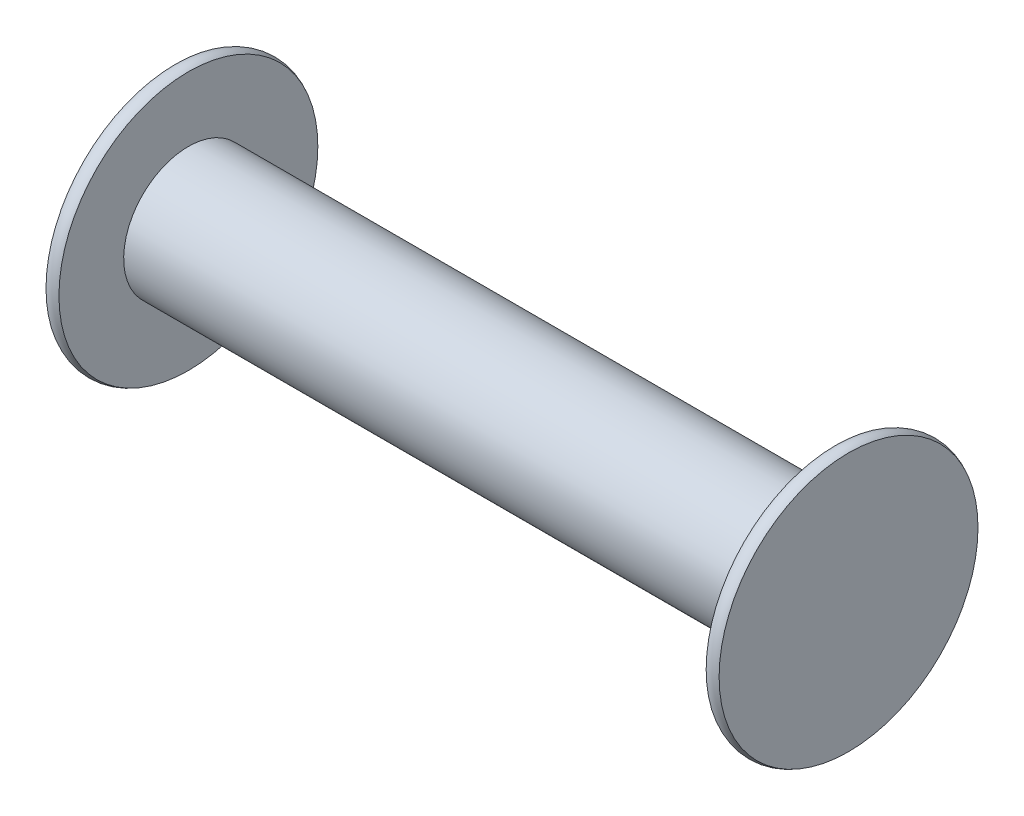
ISO-10303-21;
HEADER;
FILE_DESCRIPTION(('STEP AP214'),'2;1');
FILE_NAME('part.step','',(''),(''),'','','');
FILE_SCHEMA(('AUTOMOTIVE_DESIGN { 1 0 10303 214 1 1 1 1 }'));
ENDSEC;
DATA;
#1=APPLICATION_CONTEXT('core data for automotive mechanical design processes');
#2=APPLICATION_PROTOCOL_DEFINITION('international standard','automotive_design',2000,#1);
#3=PRODUCT_CONTEXT('',#1,'mechanical');
#4=PRODUCT('Part','Part','',(#3));
#5=PRODUCT_RELATED_PRODUCT_CATEGORY('part','',(#4));
#6=PRODUCT_DEFINITION_FORMATION('','',#4);
#7=PRODUCT_DEFINITION_CONTEXT('part definition',#1,'design');
#8=PRODUCT_DEFINITION('design','',#6,#7);
#9=PRODUCT_DEFINITION_SHAPE('','',#8);
#10=(LENGTH_UNIT() NAMED_UNIT(*) SI_UNIT(.MILLI.,.METRE.));
#11=(NAMED_UNIT(*) PLANE_ANGLE_UNIT() SI_UNIT($,.RADIAN.));
#12=(NAMED_UNIT(*) SI_UNIT($,.STERADIAN.) SOLID_ANGLE_UNIT());
#13=UNCERTAINTY_MEASURE_WITH_UNIT(LENGTH_MEASURE(1.E-05),#10,'distance_accuracy_value','');
#14=(GEOMETRIC_REPRESENTATION_CONTEXT(3) GLOBAL_UNCERTAINTY_ASSIGNED_CONTEXT((#13)) GLOBAL_UNIT_ASSIGNED_CONTEXT((#10,
#11,#12)) REPRESENTATION_CONTEXT('',''));
#15=CARTESIAN_POINT('',(0.,0.,0.));
#16=DIRECTION('',(0.,0.,1.));
#17=DIRECTION('',(1.,0.,0.));
#18=AXIS2_PLACEMENT_3D('',#15,#16,#17);
#19=CARTESIAN_POINT('',(-26.,0.,0.));
#20=DIRECTION('',(-1.,0.,0.));
#21=DIRECTION('',(0.,-1.,0.));
#22=AXIS2_PLACEMENT_3D('',#19,#20,#21);
#23=PLANE('',#22);
#24=CARTESIAN_POINT('',(-26.,0.,0.));
#25=DIRECTION('',(-1.,0.,0.));
#26=DIRECTION('',(0.,-1.,0.));
#27=AXIS2_PLACEMENT_3D('',#24,#25,#26);
#28=CIRCLE('',#27,10.);
#29=CARTESIAN_POINT('',(-26.,-10.,0.));
#30=VERTEX_POINT('',#29);
#31=EDGE_CURVE('E10',#30,#30,#28,.T.);
#32=ORIENTED_EDGE('',*,*,#31,.T.);
#33=EDGE_LOOP('',(#32));
#34=FACE_BOUND('',#33,.T.);
#35=ADVANCED_FACE('F37',(#34),#23,.T.);
#36=CARTESIAN_POINT('',(-25.5,0.,0.));
#37=DIRECTION('',(-1.,0.,0.));
#38=DIRECTION('',(0.,-1.,0.));
#39=AXIS2_PLACEMENT_3D('',#36,#37,#38);
#40=TOROIDAL_SURFACE('',#39,9.13397459621556,0.999999999999999);
#41=CARTESIAN_POINT('',(-25.,0.,0.));
#42=DIRECTION('',(-1.,0.,0.));
#43=DIRECTION('',(0.,-1.,0.));
#44=AXIS2_PLACEMENT_3D('',#41,#42,#43);
#45=CIRCLE('',#44,10.);
#46=CARTESIAN_POINT('',(-25.,-10.,0.));
#47=VERTEX_POINT('',#46);
#48=EDGE_CURVE('E44',#47,#47,#45,.T.);
#49=ORIENTED_EDGE('',*,*,#48,.T.);
#50=EDGE_LOOP('',(#49));
#51=FACE_BOUND('',#50,.T.);
#52=ORIENTED_EDGE('',*,*,#31,.F.);
#53=EDGE_LOOP('',(#52));
#54=FACE_BOUND('',#53,.T.);
#55=ADVANCED_FACE('F81',(#51,#54),#40,.T.);
#56=CARTESIAN_POINT('',(-25.,-5.,0.));
#57=DIRECTION('',(1.,0.,0.));
#58=DIRECTION('',(0.,1.,0.));
#59=AXIS2_PLACEMENT_3D('',#56,#57,#58);
#60=PLANE('',#59);
#61=CARTESIAN_POINT('',(-25.,0.,0.));
#62=DIRECTION('',(-1.,0.,0.));
#63=DIRECTION('',(0.,-1.,0.));
#64=AXIS2_PLACEMENT_3D('',#61,#62,#63);
#65=CIRCLE('',#64,5.);
#66=CARTESIAN_POINT('',(-25.,-5.,0.));
#67=VERTEX_POINT('',#66);
#68=EDGE_CURVE('E49',#67,#67,#65,.T.);
#69=ORIENTED_EDGE('',*,*,#68,.T.);
#70=EDGE_LOOP('',(#69));
#71=FACE_BOUND('',#70,.T.);
#72=ORIENTED_EDGE('',*,*,#48,.F.);
#73=EDGE_LOOP('',(#72));
#74=FACE_BOUND('',#73,.T.);
#75=ADVANCED_FACE('F85',(#71,#74),#60,.T.);
#76=CARTESIAN_POINT('',(-26.,0.,0.));
#77=DIRECTION('',(-1.,0.,0.));
#78=DIRECTION('',(0.,-1.,0.));
#79=AXIS2_PLACEMENT_3D('',#76,#77,#78);
#80=CYLINDRICAL_SURFACE('',#79,5.);
#81=CARTESIAN_POINT('',(25.,0.,0.));
#82=DIRECTION('',(-1.,0.,0.));
#83=DIRECTION('',(0.,-1.,0.));
#84=AXIS2_PLACEMENT_3D('',#81,#82,#83);
#85=CIRCLE('',#84,5.);
#86=CARTESIAN_POINT('',(25.,-4.99999999999999,0.));
#87=VERTEX_POINT('',#86);
#88=EDGE_CURVE('E54',#87,#87,#85,.T.);
#89=ORIENTED_EDGE('',*,*,#88,.T.);
#90=EDGE_LOOP('',(#89));
#91=FACE_BOUND('',#90,.T.);
#92=ORIENTED_EDGE('',*,*,#68,.F.);
#93=EDGE_LOOP('',(#92));
#94=FACE_BOUND('',#93,.T.);
#95=ADVANCED_FACE('F89',(#91,#94),#80,.T.);
#96=CARTESIAN_POINT('',(25.,-4.99999999999999,0.));
#97=DIRECTION('',(-1.,0.,0.));
#98=DIRECTION('',(0.,-1.,0.));
#99=AXIS2_PLACEMENT_3D('',#96,#97,#98);
#100=PLANE('',#99);
#101=CARTESIAN_POINT('',(25.,0.,0.));
#102=DIRECTION('',(-1.,0.,0.));
#103=DIRECTION('',(0.,-1.,0.));
#104=AXIS2_PLACEMENT_3D('',#101,#102,#103);
#105=CIRCLE('',#104,10.);
#106=CARTESIAN_POINT('',(25.,-9.99999999999999,0.));
#107=VERTEX_POINT('',#106);
#108=EDGE_CURVE('E60',#107,#107,#105,.T.);
#109=ORIENTED_EDGE('',*,*,#108,.T.);
#110=EDGE_LOOP('',(#109));
#111=FACE_BOUND('',#110,.T.);
#112=ORIENTED_EDGE('',*,*,#88,.F.);
#113=EDGE_LOOP('',(#112));
#114=FACE_BOUND('',#113,.T.);
#115=ADVANCED_FACE('F78',(#111,#114),#100,.T.);
#116=CARTESIAN_POINT('',(25.5,0.,0.));
#117=DIRECTION('',(-1.,0.,0.));
#118=DIRECTION('',(0.,-1.,0.));
#119=AXIS2_PLACEMENT_3D('',#116,#117,#118);
#120=TOROIDAL_SURFACE('',#119,9.13397459621556,1.);
#121=CARTESIAN_POINT('',(26.,0.,0.));
#122=DIRECTION('',(-1.,0.,0.));
#123=DIRECTION('',(0.,-1.,0.));
#124=AXIS2_PLACEMENT_3D('',#121,#122,#123);
#125=CIRCLE('',#124,10.);
#126=CARTESIAN_POINT('',(26.,-9.99999999999999,0.));
#127=VERTEX_POINT('',#126);
#128=EDGE_CURVE('E64',#127,#127,#125,.T.);
#129=ORIENTED_EDGE('',*,*,#128,.T.);
#130=EDGE_LOOP('',(#129));
#131=FACE_BOUND('',#130,.T.);
#132=ORIENTED_EDGE('',*,*,#108,.F.);
#133=EDGE_LOOP('',(#132));
#134=FACE_BOUND('',#133,.T.);
#135=ADVANCED_FACE('F69',(#131,#134),#120,.T.);
#136=CARTESIAN_POINT('',(26.,0.,0.));
#137=DIRECTION('',(1.,0.,0.));
#138=DIRECTION('',(0.,1.,0.));
#139=AXIS2_PLACEMENT_3D('',#136,#137,#138);
#140=PLANE('',#139);
#141=ORIENTED_EDGE('',*,*,#128,.F.);
#142=EDGE_LOOP('',(#141));
#143=FACE_BOUND('',#142,.T.);
#144=ADVANCED_FACE('F72',(#143),#140,.T.);
#145=CLOSED_SHELL('',(#35,#55,#75,#95,#115,#135,#144));
#146=MANIFOLD_SOLID_BREP('B2',#145);
#147=ADVANCED_BREP_SHAPE_REPRESENTATION('',(#18,#146),#14);
#148=SHAPE_DEFINITION_REPRESENTATION(#9,#147);
ENDSEC;
END-ISO-10303-21;
